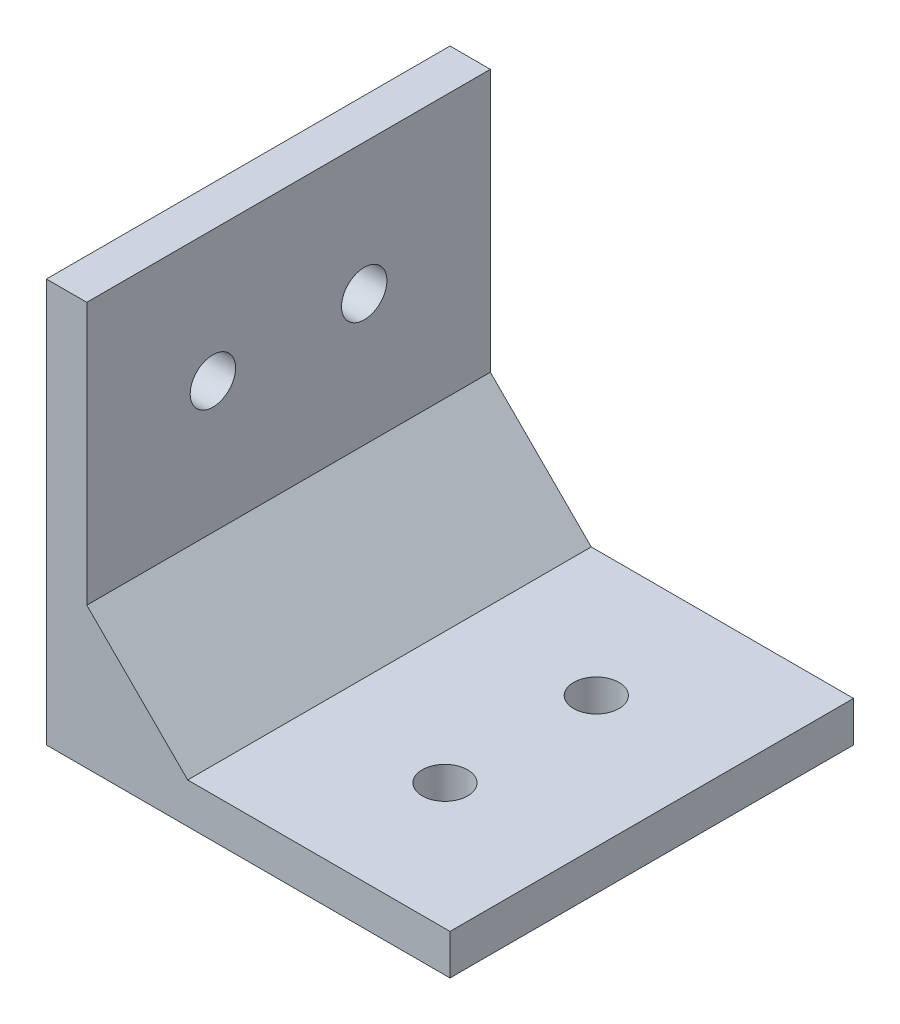
ISO-10303-21;
HEADER;
FILE_DESCRIPTION(('STEP AP214'),'2;1');
FILE_NAME('part.step','',(''),(''),'','','');
FILE_SCHEMA(('AUTOMOTIVE_DESIGN { 1 0 10303 214 1 1 1 1 }'));
ENDSEC;
DATA;
#1=APPLICATION_CONTEXT('core data for automotive mechanical design processes');
#2=APPLICATION_PROTOCOL_DEFINITION('international standard','automotive_design',2000,#1);
#3=PRODUCT_CONTEXT('',#1,'mechanical');
#4=PRODUCT('Part','Part','',(#3));
#5=PRODUCT_RELATED_PRODUCT_CATEGORY('part','',(#4));
#6=PRODUCT_DEFINITION_FORMATION('','',#4);
#7=PRODUCT_DEFINITION_CONTEXT('part definition',#1,'design');
#8=PRODUCT_DEFINITION('design','',#6,#7);
#9=PRODUCT_DEFINITION_SHAPE('','',#8);
#10=(LENGTH_UNIT() NAMED_UNIT(*) SI_UNIT(.MILLI.,.METRE.));
#11=(NAMED_UNIT(*) PLANE_ANGLE_UNIT() SI_UNIT($,.RADIAN.));
#12=(NAMED_UNIT(*) SI_UNIT($,.STERADIAN.) SOLID_ANGLE_UNIT());
#13=UNCERTAINTY_MEASURE_WITH_UNIT(LENGTH_MEASURE(1.E-05),#10,'distance_accuracy_value','');
#14=(GEOMETRIC_REPRESENTATION_CONTEXT(3) GLOBAL_UNCERTAINTY_ASSIGNED_CONTEXT((#13)) GLOBAL_UNIT_ASSIGNED_CONTEXT((#10,
#11,#12)) REPRESENTATION_CONTEXT('',''));
#15=CARTESIAN_POINT('',(0.,0.,0.));
#16=DIRECTION('',(0.,0.,1.));
#17=DIRECTION('',(1.,0.,0.));
#18=AXIS2_PLACEMENT_3D('',#15,#16,#17);
#19=CARTESIAN_POINT('',(0.,4.,0.));
#20=DIRECTION('',(-1.,0.,0.));
#21=DIRECTION('',(0.,0.,1.));
#22=AXIS2_PLACEMENT_3D('',#19,#20,#21);
#23=PLANE('',#22);
#24=DIRECTION('',(0.,0.,-1.));
#25=VECTOR('',#24,1.);
#26=CARTESIAN_POINT('',(0.,0.,0.));
#27=LINE('',#26,#25);
#28=CARTESIAN_POINT('',(0.,0.,0.));
#29=VERTEX_POINT('',#28);
#30=CARTESIAN_POINT('',(0.,0.,-40.));
#31=VERTEX_POINT('',#30);
#32=EDGE_CURVE('E122',#29,#31,#27,.T.);
#33=ORIENTED_EDGE('',*,*,#32,.T.);
#34=DIRECTION('',(0.,-1.,0.));
#35=VECTOR('',#34,1.);
#36=CARTESIAN_POINT('',(0.,4.,-40.));
#37=LINE('',#36,#35);
#38=CARTESIAN_POINT('',(0.,4.,-40.));
#39=VERTEX_POINT('',#38);
#40=EDGE_CURVE('E150',#39,#31,#37,.T.);
#41=ORIENTED_EDGE('',*,*,#40,.F.);
#42=DIRECTION('',(0.,0.,-1.));
#43=VECTOR('',#42,1.);
#44=CARTESIAN_POINT('',(0.,4.,0.));
#45=LINE('',#44,#43);
#46=CARTESIAN_POINT('',(0.,4.,0.));
#47=VERTEX_POINT('',#46);
#48=EDGE_CURVE('E131',#47,#39,#45,.T.);
#49=ORIENTED_EDGE('',*,*,#48,.F.);
#50=DIRECTION('',(0.,-1.,0.));
#51=VECTOR('',#50,1.);
#52=CARTESIAN_POINT('',(0.,4.,0.));
#53=LINE('',#52,#51);
#54=EDGE_CURVE('E138',#47,#29,#53,.T.);
#55=ORIENTED_EDGE('',*,*,#54,.T.);
#56=EDGE_LOOP('',(#33,#41,#49,#55));
#57=FACE_BOUND('',#56,.T.);
#58=ADVANCED_FACE('F39',(#57),#23,.F.);
#59=CARTESIAN_POINT('',(0.,4.,-40.));
#60=DIRECTION('',(0.,0.,1.));
#61=DIRECTION('',(1.,0.,0.));
#62=AXIS2_PLACEMENT_3D('',#59,#60,#61);
#63=PLANE('',#62);
#64=DIRECTION('',(-1.,0.,0.));
#65=VECTOR('',#64,1.);
#66=CARTESIAN_POINT('',(0.,0.,-40.));
#67=LINE('',#66,#65);
#68=CARTESIAN_POINT('',(-40.,0.,-40.));
#69=VERTEX_POINT('',#68);
#70=EDGE_CURVE('E126',#31,#69,#67,.T.);
#71=ORIENTED_EDGE('',*,*,#70,.T.);
#72=DIRECTION('',(0.,-1.,0.));
#73=VECTOR('',#72,1.);
#74=CARTESIAN_POINT('',(-40.,4.,-40.));
#75=LINE('',#74,#73);
#76=CARTESIAN_POINT('',(-40.,40.,-40.));
#77=VERTEX_POINT('',#76);
#78=EDGE_CURVE('E102',#77,#69,#75,.T.);
#79=ORIENTED_EDGE('',*,*,#78,.F.);
#80=DIRECTION('',(-1.,0.,0.));
#81=VECTOR('',#80,1.);
#82=CARTESIAN_POINT('',(-40.,40.,-40.));
#83=LINE('',#82,#81);
#84=CARTESIAN_POINT('',(-36.,40.,-40.));
#85=VERTEX_POINT('',#84);
#86=EDGE_CURVE('E96',#85,#77,#83,.T.);
#87=ORIENTED_EDGE('',*,*,#86,.F.);
#88=DIRECTION('',(0.,-1.,0.));
#89=VECTOR('',#88,1.);
#90=CARTESIAN_POINT('',(-36.,40.,-40.));
#91=LINE('',#90,#89);
#92=CARTESIAN_POINT('',(-36.,14.0000000000001,-40.));
#93=VERTEX_POINT('',#92);
#94=EDGE_CURVE('E100',#85,#93,#91,.T.);
#95=ORIENTED_EDGE('',*,*,#94,.T.);
#96=DIRECTION('',(0.707106781186544,-0.707106781186551,0.));
#97=VECTOR('',#96,1.);
#98=CARTESIAN_POINT('',(-13.0000000000002,-9.00000000000002,-40.));
#99=LINE('',#98,#97);
#100=CARTESIAN_POINT('',(-26.,4.,-40.));
#101=VERTEX_POINT('',#100);
#102=EDGE_CURVE('E49',#93,#101,#99,.T.);
#103=ORIENTED_EDGE('',*,*,#102,.T.);
#104=DIRECTION('',(-1.,0.,0.));
#105=VECTOR('',#104,1.);
#106=CARTESIAN_POINT('',(0.,4.,-40.));
#107=LINE('',#106,#105);
#108=EDGE_CURVE('E134',#39,#101,#107,.T.);
#109=ORIENTED_EDGE('',*,*,#108,.F.);
#110=ORIENTED_EDGE('',*,*,#40,.T.);
#111=EDGE_LOOP('',(#71,#79,#87,#95,#103,#109,#110));
#112=FACE_BOUND('',#111,.T.);
#113=ADVANCED_FACE('F98',(#112),#63,.F.);
#114=CARTESIAN_POINT('',(-40.,4.,0.));
#115=DIRECTION('',(1.,0.,0.));
#116=DIRECTION('',(0.,0.,-1.));
#117=AXIS2_PLACEMENT_3D('',#114,#115,#116);
#118=PLANE('',#117);
#119=CARTESIAN_POINT('',(-40.,27.,-27.5));
#120=DIRECTION('',(-1.,0.,0.));
#121=DIRECTION('',(0.,0.,1.));
#122=AXIS2_PLACEMENT_3D('',#119,#120,#121);
#123=CIRCLE('',#122,2.24999999999999);
#124=CARTESIAN_POINT('',(-40.,27.,-25.25));
#125=VERTEX_POINT('',#124);
#126=EDGE_CURVE('E187',#125,#125,#123,.T.);
#127=ORIENTED_EDGE('',*,*,#126,.F.);
#128=EDGE_LOOP('',(#127));
#129=FACE_BOUND('',#128,.T.);
#130=CARTESIAN_POINT('',(-40.,27.,-12.5));
#131=DIRECTION('',(-1.,0.,0.));
#132=DIRECTION('',(0.,0.,1.));
#133=AXIS2_PLACEMENT_3D('',#130,#131,#132);
#134=CIRCLE('',#133,2.24999999999999);
#135=CARTESIAN_POINT('',(-40.,27.,-10.25));
#136=VERTEX_POINT('',#135);
#137=EDGE_CURVE('E184',#136,#136,#134,.T.);
#138=ORIENTED_EDGE('',*,*,#137,.F.);
#139=EDGE_LOOP('',(#138));
#140=FACE_BOUND('',#139,.T.);
#141=DIRECTION('',(0.,0.,1.));
#142=VECTOR('',#141,1.);
#143=CARTESIAN_POINT('',(-40.,0.,0.));
#144=LINE('',#143,#142);
#145=CARTESIAN_POINT('',(-40.,0.,0.));
#146=VERTEX_POINT('',#145);
#147=EDGE_CURVE('E141',#69,#146,#144,.T.);
#148=ORIENTED_EDGE('',*,*,#147,.T.);
#149=DIRECTION('',(0.,-1.,0.));
#150=VECTOR('',#149,1.);
#151=CARTESIAN_POINT('',(-40.,4.,0.));
#152=LINE('',#151,#150);
#153=CARTESIAN_POINT('',(-40.,40.,0.));
#154=VERTEX_POINT('',#153);
#155=EDGE_CURVE('E146',#154,#146,#152,.T.);
#156=ORIENTED_EDGE('',*,*,#155,.F.);
#157=DIRECTION('',(0.,0.,1.));
#158=VECTOR('',#157,1.);
#159=CARTESIAN_POINT('',(-40.,40.,0.));
#160=LINE('',#159,#158);
#161=EDGE_CURVE('E106',#77,#154,#160,.T.);
#162=ORIENTED_EDGE('',*,*,#161,.F.);
#163=ORIENTED_EDGE('',*,*,#78,.T.);
#164=EDGE_LOOP('',(#148,#156,#162,#163));
#165=FACE_BOUND('',#164,.T.);
#166=ADVANCED_FACE('F165',(#129,#140,#165),#118,.F.);
#167=CARTESIAN_POINT('',(0.,4.,0.));
#168=DIRECTION('',(0.,0.,-1.));
#169=DIRECTION('',(-1.,0.,0.));
#170=AXIS2_PLACEMENT_3D('',#167,#168,#169);
#171=PLANE('',#170);
#172=DIRECTION('',(1.,0.,0.));
#173=VECTOR('',#172,1.);
#174=CARTESIAN_POINT('',(0.,0.,0.));
#175=LINE('',#174,#173);
#176=EDGE_CURVE('E135',#146,#29,#175,.T.);
#177=ORIENTED_EDGE('',*,*,#176,.T.);
#178=ORIENTED_EDGE('',*,*,#54,.F.);
#179=DIRECTION('',(1.,0.,0.));
#180=VECTOR('',#179,1.);
#181=CARTESIAN_POINT('',(0.,4.,0.));
#182=LINE('',#181,#180);
#183=CARTESIAN_POINT('',(-26.,4.,0.));
#184=VERTEX_POINT('',#183);
#185=EDGE_CURVE('E137',#184,#47,#182,.T.);
#186=ORIENTED_EDGE('',*,*,#185,.F.);
#187=DIRECTION('',(-0.707106781186544,0.707106781186551,0.));
#188=VECTOR('',#187,1.);
#189=CARTESIAN_POINT('',(-13.0000000000002,-9.00000000000002,0.));
#190=LINE('',#189,#188);
#191=CARTESIAN_POINT('',(-36.,14.0000000000001,0.));
#192=VERTEX_POINT('',#191);
#193=EDGE_CURVE('E11',#184,#192,#190,.T.);
#194=ORIENTED_EDGE('',*,*,#193,.T.);
#195=DIRECTION('',(0.,-1.,0.));
#196=VECTOR('',#195,1.);
#197=CARTESIAN_POINT('',(-36.,40.,0.));
#198=LINE('',#197,#196);
#199=CARTESIAN_POINT('',(-36.,40.,0.));
#200=VERTEX_POINT('',#199);
#201=EDGE_CURVE('E123',#200,#192,#198,.T.);
#202=ORIENTED_EDGE('',*,*,#201,.F.);
#203=DIRECTION('',(1.,0.,0.));
#204=VECTOR('',#203,1.);
#205=CARTESIAN_POINT('',(-36.,40.,0.));
#206=LINE('',#205,#204);
#207=EDGE_CURVE('E112',#154,#200,#206,.T.);
#208=ORIENTED_EDGE('',*,*,#207,.F.);
#209=ORIENTED_EDGE('',*,*,#155,.T.);
#210=EDGE_LOOP('',(#177,#178,#186,#194,#202,#208,#209));
#211=FACE_BOUND('',#210,.T.);
#212=ADVANCED_FACE('F167',(#211),#171,.F.);
#213=CARTESIAN_POINT('',(0.,4.,0.));
#214=DIRECTION('',(0.,1.,0.));
#215=DIRECTION('',(0.,0.,1.));
#216=AXIS2_PLACEMENT_3D('',#213,#214,#215);
#217=PLANE('',#216);
#218=CARTESIAN_POINT('',(-13.,4.,-27.5));
#219=DIRECTION('',(0.,1.,0.));
#220=DIRECTION('',(0.,0.,1.));
#221=AXIS2_PLACEMENT_3D('',#218,#219,#220);
#222=CIRCLE('',#221,2.24999999999999);
#223=CARTESIAN_POINT('',(-13.,4.,-25.25));
#224=VERTEX_POINT('',#223);
#225=EDGE_CURVE('E175',#224,#224,#222,.T.);
#226=ORIENTED_EDGE('',*,*,#225,.F.);
#227=EDGE_LOOP('',(#226));
#228=FACE_BOUND('',#227,.T.);
#229=CARTESIAN_POINT('',(-13.,4.,-12.5));
#230=DIRECTION('',(0.,1.,0.));
#231=DIRECTION('',(0.,0.,1.));
#232=AXIS2_PLACEMENT_3D('',#229,#230,#231);
#233=CIRCLE('',#232,2.24999999999999);
#234=CARTESIAN_POINT('',(-13.,4.,-10.25));
#235=VERTEX_POINT('',#234);
#236=EDGE_CURVE('E116',#235,#235,#233,.T.);
#237=ORIENTED_EDGE('',*,*,#236,.F.);
#238=EDGE_LOOP('',(#237));
#239=FACE_BOUND('',#238,.T.);
#240=ORIENTED_EDGE('',*,*,#108,.T.);
#241=DIRECTION('',(0.,0.,1.));
#242=VECTOR('',#241,1.);
#243=CARTESIAN_POINT('',(-26.,4.,0.));
#244=LINE('',#243,#242);
#245=EDGE_CURVE('E62',#101,#184,#244,.T.);
#246=ORIENTED_EDGE('',*,*,#245,.T.);
#247=ORIENTED_EDGE('',*,*,#185,.T.);
#248=ORIENTED_EDGE('',*,*,#48,.T.);
#249=EDGE_LOOP('',(#240,#246,#247,#248));
#250=FACE_BOUND('',#249,.T.);
#251=ADVANCED_FACE('F217',(#228,#239,#250),#217,.T.);
#252=CARTESIAN_POINT('',(0.,0.,0.));
#253=DIRECTION('',(0.,1.,0.));
#254=DIRECTION('',(0.,0.,1.));
#255=AXIS2_PLACEMENT_3D('',#252,#253,#254);
#256=PLANE('',#255);
#257=CARTESIAN_POINT('',(-13.,0.,-27.5));
#258=DIRECTION('',(0.,-1.,0.));
#259=DIRECTION('',(0.,0.,-1.));
#260=AXIS2_PLACEMENT_3D('',#257,#258,#259);
#261=CIRCLE('',#260,2.24999999999999);
#262=CARTESIAN_POINT('',(-13.,0.,-29.75));
#263=VERTEX_POINT('',#262);
#264=EDGE_CURVE('E178',#263,#263,#261,.T.);
#265=ORIENTED_EDGE('',*,*,#264,.F.);
#266=EDGE_LOOP('',(#265));
#267=FACE_BOUND('',#266,.T.);
#268=CARTESIAN_POINT('',(-13.,0.,-12.5));
#269=DIRECTION('',(0.,-1.,0.));
#270=DIRECTION('',(0.,0.,-1.));
#271=AXIS2_PLACEMENT_3D('',#268,#269,#270);
#272=CIRCLE('',#271,2.24999999999999);
#273=CARTESIAN_POINT('',(-13.,0.,-14.75));
#274=VERTEX_POINT('',#273);
#275=EDGE_CURVE('E172',#274,#274,#272,.T.);
#276=ORIENTED_EDGE('',*,*,#275,.F.);
#277=EDGE_LOOP('',(#276));
#278=FACE_BOUND('',#277,.T.);
#279=ORIENTED_EDGE('',*,*,#32,.F.);
#280=ORIENTED_EDGE('',*,*,#176,.F.);
#281=ORIENTED_EDGE('',*,*,#147,.F.);
#282=ORIENTED_EDGE('',*,*,#70,.F.);
#283=EDGE_LOOP('',(#279,#280,#281,#282));
#284=FACE_BOUND('',#283,.T.);
#285=ADVANCED_FACE('F162',(#267,#278,#284),#256,.F.);
#286=CARTESIAN_POINT('',(-36.,40.,-40.));
#287=DIRECTION('',(-1.,0.,0.));
#288=DIRECTION('',(0.,0.,1.));
#289=AXIS2_PLACEMENT_3D('',#286,#287,#288);
#290=PLANE('',#289);
#291=CARTESIAN_POINT('',(-36.,27.,-27.5));
#292=DIRECTION('',(-1.,0.,0.));
#293=DIRECTION('',(0.,0.,1.));
#294=AXIS2_PLACEMENT_3D('',#291,#292,#293);
#295=CIRCLE('',#294,2.24999999999999);
#296=CARTESIAN_POINT('',(-36.,27.,-25.25));
#297=VERTEX_POINT('',#296);
#298=EDGE_CURVE('E44',#297,#297,#295,.T.);
#299=ORIENTED_EDGE('',*,*,#298,.T.);
#300=EDGE_LOOP('',(#299));
#301=FACE_BOUND('',#300,.T.);
#302=CARTESIAN_POINT('',(-36.,27.,-12.5));
#303=DIRECTION('',(-1.,0.,0.));
#304=DIRECTION('',(0.,0.,1.));
#305=AXIS2_PLACEMENT_3D('',#302,#303,#304);
#306=CIRCLE('',#305,2.24999999999999);
#307=CARTESIAN_POINT('',(-36.,27.,-10.25));
#308=VERTEX_POINT('',#307);
#309=EDGE_CURVE('E181',#308,#308,#306,.T.);
#310=ORIENTED_EDGE('',*,*,#309,.T.);
#311=EDGE_LOOP('',(#310));
#312=FACE_BOUND('',#311,.T.);
#313=ORIENTED_EDGE('',*,*,#201,.T.);
#314=DIRECTION('',(0.,0.,-1.));
#315=VECTOR('',#314,1.);
#316=CARTESIAN_POINT('',(-36.,14.0000000000001,-40.));
#317=LINE('',#316,#315);
#318=EDGE_CURVE('E121',#192,#93,#317,.T.);
#319=ORIENTED_EDGE('',*,*,#318,.T.);
#320=ORIENTED_EDGE('',*,*,#94,.F.);
#321=DIRECTION('',(0.,0.,-1.));
#322=VECTOR('',#321,1.);
#323=CARTESIAN_POINT('',(-36.,40.,-40.));
#324=LINE('',#323,#322);
#325=EDGE_CURVE('E107',#200,#85,#324,.T.);
#326=ORIENTED_EDGE('',*,*,#325,.F.);
#327=EDGE_LOOP('',(#313,#319,#320,#326));
#328=FACE_BOUND('',#327,.T.);
#329=ADVANCED_FACE('F119',(#301,#312,#328),#290,.F.);
#330=CARTESIAN_POINT('',(0.,40.,0.));
#331=DIRECTION('',(0.,-1.,0.));
#332=DIRECTION('',(0.,0.,-1.));
#333=AXIS2_PLACEMENT_3D('',#330,#331,#332);
#334=PLANE('',#333);
#335=ORIENTED_EDGE('',*,*,#325,.T.);
#336=ORIENTED_EDGE('',*,*,#86,.T.);
#337=ORIENTED_EDGE('',*,*,#161,.T.);
#338=ORIENTED_EDGE('',*,*,#207,.T.);
#339=EDGE_LOOP('',(#335,#336,#337,#338));
#340=FACE_BOUND('',#339,.T.);
#341=ADVANCED_FACE('F110',(#340),#334,.F.);
#342=CARTESIAN_POINT('',(-36.,14.0000000000001,-40.));
#343=DIRECTION('',(-0.707106781186551,-0.707106781186544,0.));
#344=DIRECTION('',(0.,0.,-1.));
#345=AXIS2_PLACEMENT_3D('',#342,#343,#344);
#346=PLANE('',#345);
#347=ORIENTED_EDGE('',*,*,#193,.F.);
#348=ORIENTED_EDGE('',*,*,#245,.F.);
#349=ORIENTED_EDGE('',*,*,#102,.F.);
#350=ORIENTED_EDGE('',*,*,#318,.F.);
#351=EDGE_LOOP('',(#347,#348,#349,#350));
#352=FACE_BOUND('',#351,.T.);
#353=ADVANCED_FACE('F42',(#352),#346,.F.);
#354=CARTESIAN_POINT('',(-13.,0.,-12.5));
#355=DIRECTION('',(0.,-1.,0.));
#356=DIRECTION('',(0.,0.,-1.));
#357=AXIS2_PLACEMENT_3D('',#354,#355,#356);
#358=CYLINDRICAL_SURFACE('',#357,2.24999999999999);
#359=ORIENTED_EDGE('',*,*,#236,.T.);
#360=EDGE_LOOP('',(#359));
#361=FACE_BOUND('',#360,.T.);
#362=ORIENTED_EDGE('',*,*,#275,.T.);
#363=EDGE_LOOP('',(#362));
#364=FACE_BOUND('',#363,.T.);
#365=ADVANCED_FACE('F228',(#361,#364),#358,.F.);
#366=CARTESIAN_POINT('',(-13.,0.,-27.5));
#367=DIRECTION('',(0.,-1.,0.));
#368=DIRECTION('',(0.,0.,-1.));
#369=AXIS2_PLACEMENT_3D('',#366,#367,#368);
#370=CYLINDRICAL_SURFACE('',#369,2.24999999999999);
#371=ORIENTED_EDGE('',*,*,#225,.T.);
#372=EDGE_LOOP('',(#371));
#373=FACE_BOUND('',#372,.T.);
#374=ORIENTED_EDGE('',*,*,#264,.T.);
#375=EDGE_LOOP('',(#374));
#376=FACE_BOUND('',#375,.T.);
#377=ADVANCED_FACE('F203',(#373,#376),#370,.F.);
#378=CARTESIAN_POINT('',(-40.,27.,-12.5));
#379=DIRECTION('',(-1.,0.,0.));
#380=DIRECTION('',(0.,0.,1.));
#381=AXIS2_PLACEMENT_3D('',#378,#379,#380);
#382=CYLINDRICAL_SURFACE('',#381,2.24999999999999);
#383=ORIENTED_EDGE('',*,*,#137,.T.);
#384=EDGE_LOOP('',(#383));
#385=FACE_BOUND('',#384,.T.);
#386=ORIENTED_EDGE('',*,*,#309,.F.);
#387=EDGE_LOOP('',(#386));
#388=FACE_BOUND('',#387,.T.);
#389=ADVANCED_FACE('F198',(#385,#388),#382,.F.);
#390=CARTESIAN_POINT('',(-40.,27.,-27.5));
#391=DIRECTION('',(-1.,0.,0.));
#392=DIRECTION('',(0.,0.,1.));
#393=AXIS2_PLACEMENT_3D('',#390,#391,#392);
#394=CYLINDRICAL_SURFACE('',#393,2.24999999999999);
#395=ORIENTED_EDGE('',*,*,#126,.T.);
#396=EDGE_LOOP('',(#395));
#397=FACE_BOUND('',#396,.T.);
#398=ORIENTED_EDGE('',*,*,#298,.F.);
#399=EDGE_LOOP('',(#398));
#400=FACE_BOUND('',#399,.T.);
#401=ADVANCED_FACE('F196',(#397,#400),#394,.F.);
#402=CLOSED_SHELL('',(#58,#113,#166,#212,#251,#285,#329,#341,#353,#365,#377,#389,#401));
#403=MANIFOLD_SOLID_BREP('B2',#402);
#404=ADVANCED_BREP_SHAPE_REPRESENTATION('',(#18,#403),#14);
#405=SHAPE_DEFINITION_REPRESENTATION(#9,#404);
ENDSEC;
END-ISO-10303-21;
